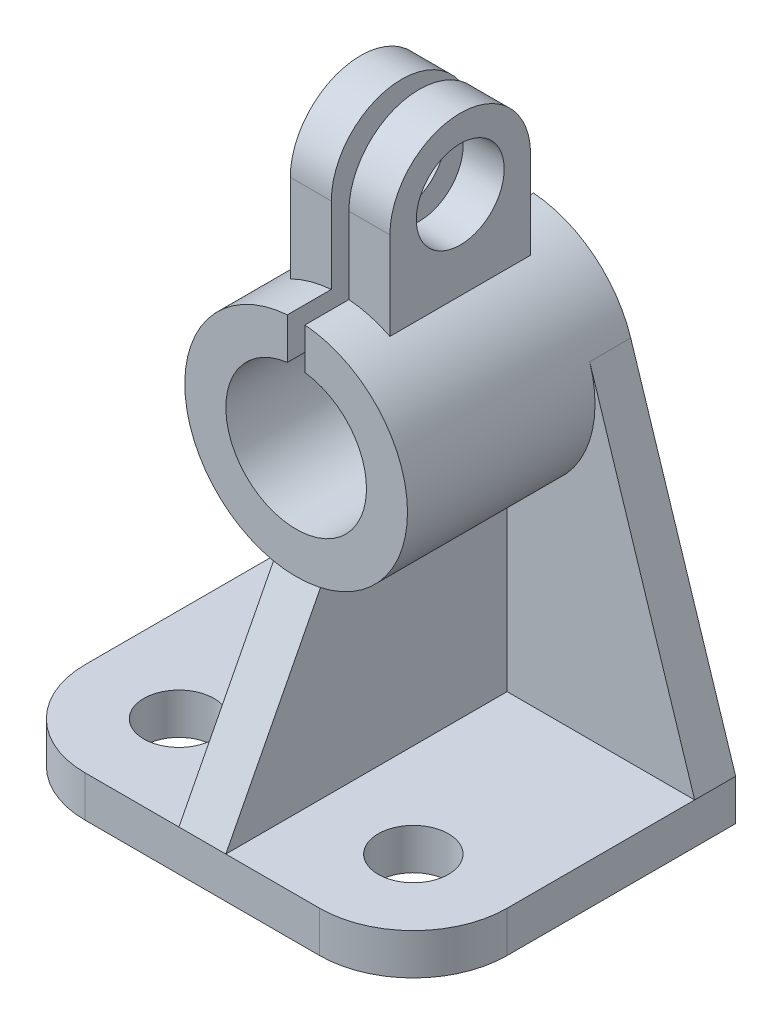
ISO-10303-21;
HEADER;
FILE_DESCRIPTION(('STEP AP214'),'2;1');
FILE_NAME('part.step','',(''),(''),'','','');
FILE_SCHEMA(('AUTOMOTIVE_DESIGN { 1 0 10303 214 1 1 1 1 }'));
ENDSEC;
DATA;
#1=APPLICATION_CONTEXT('core data for automotive mechanical design processes');
#2=APPLICATION_PROTOCOL_DEFINITION('international standard','automotive_design',2000,#1);
#3=PRODUCT_CONTEXT('',#1,'mechanical');
#4=PRODUCT('Part','Part','',(#3));
#5=PRODUCT_RELATED_PRODUCT_CATEGORY('part','',(#4));
#6=PRODUCT_DEFINITION_FORMATION('','',#4);
#7=PRODUCT_DEFINITION_CONTEXT('part definition',#1,'design');
#8=PRODUCT_DEFINITION('design','',#6,#7);
#9=PRODUCT_DEFINITION_SHAPE('','',#8);
#10=(LENGTH_UNIT() NAMED_UNIT(*) SI_UNIT(.MILLI.,.METRE.));
#11=(NAMED_UNIT(*) PLANE_ANGLE_UNIT() SI_UNIT($,.RADIAN.));
#12=(NAMED_UNIT(*) SI_UNIT($,.STERADIAN.) SOLID_ANGLE_UNIT());
#13=UNCERTAINTY_MEASURE_WITH_UNIT(LENGTH_MEASURE(1.E-05),#10,'distance_accuracy_value','');
#14=(GEOMETRIC_REPRESENTATION_CONTEXT(3) GLOBAL_UNCERTAINTY_ASSIGNED_CONTEXT((#13)) GLOBAL_UNIT_ASSIGNED_CONTEXT((#10,
#11,#12)) REPRESENTATION_CONTEXT('',''));
#15=CARTESIAN_POINT('',(0.,0.,0.));
#16=DIRECTION('',(0.,0.,1.));
#17=DIRECTION('',(1.,0.,0.));
#18=AXIS2_PLACEMENT_3D('',#15,#16,#17);
#19=CARTESIAN_POINT('',(0.,3.5,55.));
#20=DIRECTION('',(0.,1.,0.));
#21=DIRECTION('',(0.,0.,1.));
#22=AXIS2_PLACEMENT_3D('',#19,#20,#21);
#23=PLANE('',#22);
#24=CARTESIAN_POINT('',(-20.,3.5,39.));
#25=DIRECTION('',(0.,1.,0.));
#26=DIRECTION('',(0.,0.,1.));
#27=AXIS2_PLACEMENT_3D('',#24,#25,#26);
#28=CIRCLE('',#27,6.);
#29=CARTESIAN_POINT('',(-20.,3.5,45.));
#30=VERTEX_POINT('',#29);
#31=EDGE_CURVE('E432',#30,#30,#28,.T.);
#32=ORIENTED_EDGE('',*,*,#31,.F.);
#33=EDGE_LOOP('',(#32));
#34=FACE_BOUND('',#33,.T.);
#35=DIRECTION('',(0.,0.,-1.));
#36=VECTOR('',#35,1.);
#37=CARTESIAN_POINT('',(-36.,3.5,55.));
#38=LINE('',#37,#36);
#39=CARTESIAN_POINT('',(-36.,3.5,39.));
#40=VERTEX_POINT('',#39);
#41=CARTESIAN_POINT('',(-36.,3.5,7.));
#42=VERTEX_POINT('',#41);
#43=EDGE_CURVE('E358',#40,#42,#38,.T.);
#44=ORIENTED_EDGE('',*,*,#43,.F.);
#45=CARTESIAN_POINT('',(-20.,3.5,39.));
#46=DIRECTION('',(0.,1.,0.));
#47=DIRECTION('',(0.,0.,1.));
#48=AXIS2_PLACEMENT_3D('',#45,#46,#47);
#49=CIRCLE('',#48,16.);
#50=CARTESIAN_POINT('',(-20.,3.5,55.));
#51=VERTEX_POINT('',#50);
#52=EDGE_CURVE('E387',#40,#51,#49,.T.);
#53=ORIENTED_EDGE('',*,*,#52,.T.);
#54=DIRECTION('',(1.,0.,0.));
#55=VECTOR('',#54,1.);
#56=CARTESIAN_POINT('',(0.,3.5,55.));
#57=LINE('',#56,#55);
#58=CARTESIAN_POINT('',(-4.,3.5,55.));
#59=VERTEX_POINT('',#58);
#60=EDGE_CURVE('E348',#51,#59,#57,.T.);
#61=ORIENTED_EDGE('',*,*,#60,.T.);
#62=DIRECTION('',(0.,0.,-1.));
#63=VECTOR('',#62,1.);
#64=CARTESIAN_POINT('',(-4.,3.5,55.));
#65=LINE('',#64,#63);
#66=CARTESIAN_POINT('',(-4.,3.5,7.));
#67=VERTEX_POINT('',#66);
#68=EDGE_CURVE('E231',#59,#67,#65,.T.);
#69=ORIENTED_EDGE('',*,*,#68,.T.);
#70=DIRECTION('',(1.,0.,0.));
#71=VECTOR('',#70,1.);
#72=CARTESIAN_POINT('',(0.,3.5,7.));
#73=LINE('',#72,#71);
#74=EDGE_CURVE('E228',#42,#67,#73,.T.);
#75=ORIENTED_EDGE('',*,*,#74,.F.);
#76=EDGE_LOOP('',(#44,#53,#61,#69,#75));
#77=FACE_BOUND('',#76,.T.);
#78=ADVANCED_FACE('F43',(#34,#77),#23,.T.);
#79=CARTESIAN_POINT('',(0.,0.,7.));
#80=DIRECTION('',(0.,0.,1.));
#81=DIRECTION('',(1.,0.,0.));
#82=AXIS2_PLACEMENT_3D('',#79,#80,#81);
#83=PLANE('',#82);
#84=ORIENTED_EDGE('',*,*,#74,.T.);
#85=DIRECTION('',(0.,1.,0.));
#86=VECTOR('',#85,1.);
#87=CARTESIAN_POINT('',(-4.,0.,7.));
#88=LINE('',#87,#86);
#89=CARTESIAN_POINT('',(-4.,34.9258243789933,7.));
#90=VERTEX_POINT('',#89);
#91=EDGE_CURVE('E225',#67,#90,#88,.T.);
#92=ORIENTED_EDGE('',*,*,#91,.T.);
#93=CARTESIAN_POINT('',(0.,53.5,7.));
#94=DIRECTION('',(0.,0.,1.));
#95=DIRECTION('',(1.,0.,0.));
#96=AXIS2_PLACEMENT_3D('',#93,#94,#95);
#97=CIRCLE('',#96,19.);
#98=CARTESIAN_POINT('',(-18.0912616954563,59.3057084207285,7.));
#99=VERTEX_POINT('',#98);
#100=EDGE_CURVE('E210',#99,#90,#97,.T.);
#101=ORIENTED_EDGE('',*,*,#100,.F.);
#102=DIRECTION('',(-0.305563601090973,-0.952171668181907,0.));
#103=VECTOR('',#102,1.);
#104=CARTESIAN_POINT('',(-33.657033398032,10.8009560364036,7.));
#105=LINE('',#104,#103);
#106=EDGE_CURVE('E220',#99,#42,#105,.T.);
#107=ORIENTED_EDGE('',*,*,#106,.T.);
#108=EDGE_LOOP('',(#84,#92,#101,#107));
#109=FACE_BOUND('',#108,.T.);
#110=ADVANCED_FACE('F226',(#109),#83,.T.);
#111=CARTESIAN_POINT('',(0.,53.5,39.));
#112=DIRECTION('',(0.,0.,-1.));
#113=DIRECTION('',(-1.,0.,0.));
#114=AXIS2_PLACEMENT_3D('',#111,#112,#113);
#115=CYLINDRICAL_SURFACE('',#114,19.);
#116=CARTESIAN_POINT('',(0.,53.5,0.));
#117=DIRECTION('',(0.,0.,1.));
#118=DIRECTION('',(1.,0.,0.));
#119=AXIS2_PLACEMENT_3D('',#116,#117,#118);
#120=CIRCLE('',#119,19.);
#121=CARTESIAN_POINT('',(18.0912616954563,59.3057084207285,0.));
#122=VERTEX_POINT('',#121);
#123=CARTESIAN_POINT('',(1.5,72.4406969248758,0.));
#124=VERTEX_POINT('',#123);
#125=EDGE_CURVE('E287',#122,#124,#120,.T.);
#126=ORIENTED_EDGE('',*,*,#125,.T.);
#127=DIRECTION('',(0.,0.,-1.));
#128=VECTOR('',#127,1.);
#129=CARTESIAN_POINT('',(1.5,72.4406969248758,39.));
#130=LINE('',#129,#128);
#131=CARTESIAN_POINT('',(1.5,72.4406969248758,7.5));
#132=VERTEX_POINT('',#131);
#133=EDGE_CURVE('E318',#132,#124,#130,.T.);
#134=ORIENTED_EDGE('',*,*,#133,.F.);
#135=CARTESIAN_POINT('',(0.,53.5,7.5));
#136=DIRECTION('',(0.,0.,1.));
#137=DIRECTION('',(1.,0.,0.));
#138=AXIS2_PLACEMENT_3D('',#135,#136,#137);
#139=CIRCLE('',#138,19.);
#140=CARTESIAN_POINT('',(8.5,70.4926454679664,7.5));
#141=VERTEX_POINT('',#140);
#142=EDGE_CURVE('E269',#141,#132,#139,.T.);
#143=ORIENTED_EDGE('',*,*,#142,.F.);
#144=DIRECTION('',(0.,0.,-1.));
#145=VECTOR('',#144,1.);
#146=CARTESIAN_POINT('',(8.5,70.4926454679664,31.5));
#147=LINE('',#146,#145);
#148=CARTESIAN_POINT('',(8.5,70.4926454679664,31.5));
#149=VERTEX_POINT('',#148);
#150=EDGE_CURVE('E279',#149,#141,#147,.T.);
#151=ORIENTED_EDGE('',*,*,#150,.F.);
#152=CARTESIAN_POINT('',(0.,53.5,31.5));
#153=DIRECTION('',(0.,0.,1.));
#154=DIRECTION('',(1.,0.,0.));
#155=AXIS2_PLACEMENT_3D('',#152,#153,#154);
#156=CIRCLE('',#155,19.);
#157=CARTESIAN_POINT('',(1.5,72.4406969248758,31.5));
#158=VERTEX_POINT('',#157);
#159=EDGE_CURVE('E270',#149,#158,#156,.T.);
#160=ORIENTED_EDGE('',*,*,#159,.T.);
#161=CARTESIAN_POINT('',(1.5,72.4406969248758,39.));
#162=VERTEX_POINT('',#161);
#163=EDGE_CURVE('E319',#162,#158,#130,.T.);
#164=ORIENTED_EDGE('',*,*,#163,.F.);
#165=CARTESIAN_POINT('',(0.,53.5,39.));
#166=DIRECTION('',(0.,0.,1.));
#167=DIRECTION('',(1.,0.,0.));
#168=AXIS2_PLACEMENT_3D('',#165,#166,#167);
#169=CIRCLE('',#168,19.);
#170=CARTESIAN_POINT('',(0.,34.5,39.));
#171=VERTEX_POINT('',#170);
#172=EDGE_CURVE('E292',#171,#162,#169,.T.);
#173=ORIENTED_EDGE('',*,*,#172,.F.);
#174=CARTESIAN_POINT('',(0.,53.5,29.1935483870968));
#175=DIRECTION('',(0.,0.458642919770252,0.888620657054864));
#176=DIRECTION('',(0.,0.888620657054864,-0.458642919770252));
#177=AXIS2_PLACEMENT_3D('',#174,#175,#176);
#178=ELLIPSE('',#177,21.38145208437,19.);
#179=CARTESIAN_POINT('',(4.,34.9258243789933,38.7802196753583));
#180=VERTEX_POINT('',#179);
#181=EDGE_CURVE('E442',#171,#180,#178,.T.);
#182=ORIENTED_EDGE('',*,*,#181,.T.);
#183=DIRECTION('',(0.,0.,-1.));
#184=VECTOR('',#183,1.);
#185=CARTESIAN_POINT('',(4.,34.9258243789933,39.));
#186=LINE('',#185,#184);
#187=CARTESIAN_POINT('',(4.,34.9258243789933,7.));
#188=VERTEX_POINT('',#187);
#189=EDGE_CURVE('E440',#180,#188,#186,.T.);
#190=ORIENTED_EDGE('',*,*,#189,.T.);
#191=CARTESIAN_POINT('',(18.0912616954562,59.3057084207285,7.));
#192=VERTEX_POINT('',#191);
#193=EDGE_CURVE('E221',#188,#192,#97,.T.);
#194=ORIENTED_EDGE('',*,*,#193,.T.);
#195=DIRECTION('',(0.,0.,-1.));
#196=VECTOR('',#195,1.);
#197=CARTESIAN_POINT('',(18.0912616954563,59.3057084207285,7.));
#198=LINE('',#197,#196);
#199=EDGE_CURVE('E329',#192,#122,#198,.T.);
#200=ORIENTED_EDGE('',*,*,#199,.T.);
#201=EDGE_LOOP('',(#126,#134,#143,#151,#160,#164,#173,#182,#190,#194,#200));
#202=FACE_BOUND('',#201,.T.);
#203=ADVANCED_FACE('F448',(#202),#115,.T.);
#204=CARTESIAN_POINT('',(-1.5,85.5,19.5));
#205=DIRECTION('',(-1.,0.,0.));
#206=DIRECTION('',(0.,0.,1.));
#207=AXIS2_PLACEMENT_3D('',#204,#205,#206);
#208=CYLINDRICAL_SURFACE('',#207,12.);
#209=DIRECTION('',(1.,0.,0.));
#210=VECTOR('',#209,1.);
#211=CARTESIAN_POINT('',(-1.5,85.5,31.5));
#212=LINE('',#211,#210);
#213=CARTESIAN_POINT('',(-1.5,85.5,31.5));
#214=VERTEX_POINT('',#213);
#215=CARTESIAN_POINT('',(-8.5,85.5,31.5));
#216=VERTEX_POINT('',#215);
#217=EDGE_CURVE('E373',#214,#216,#212,.F.);
#218=ORIENTED_EDGE('',*,*,#217,.F.);
#219=CARTESIAN_POINT('',(-1.5,85.5,19.5));
#220=DIRECTION('',(-1.,0.,0.));
#221=DIRECTION('',(0.,-1.,0.));
#222=AXIS2_PLACEMENT_3D('',#219,#220,#221);
#223=CIRCLE('',#222,12.);
#224=CARTESIAN_POINT('',(-1.5,85.5,7.5));
#225=VERTEX_POINT('',#224);
#226=EDGE_CURVE('E378',#225,#214,#223,.F.);
#227=ORIENTED_EDGE('',*,*,#226,.F.);
#228=DIRECTION('',(-1.,0.,0.));
#229=VECTOR('',#228,1.);
#230=CARTESIAN_POINT('',(0.,85.5,7.5));
#231=LINE('',#230,#229);
#232=CARTESIAN_POINT('',(-8.5,85.5,7.5));
#233=VERTEX_POINT('',#232);
#234=EDGE_CURVE('E376',#233,#225,#231,.F.);
#235=ORIENTED_EDGE('',*,*,#234,.F.);
#236=CARTESIAN_POINT('',(-8.5,85.5,19.5));
#237=DIRECTION('',(1.,0.,0.));
#238=DIRECTION('',(0.,1.,0.));
#239=AXIS2_PLACEMENT_3D('',#236,#237,#238);
#240=CIRCLE('',#239,12.);
#241=EDGE_CURVE('E380',#216,#233,#240,.F.);
#242=ORIENTED_EDGE('',*,*,#241,.F.);
#243=EDGE_LOOP('',(#218,#227,#235,#242));
#244=FACE_BOUND('',#243,.T.);
#245=ADVANCED_FACE('F565',(#244),#208,.T.);
#246=CARTESIAN_POINT('',(8.5,85.5,19.5));
#247=DIRECTION('',(1.,0.,0.));
#248=DIRECTION('',(0.,0.,-1.));
#249=AXIS2_PLACEMENT_3D('',#246,#247,#248);
#250=CYLINDRICAL_SURFACE('',#249,12.);
#251=DIRECTION('',(-1.,0.,0.));
#252=VECTOR('',#251,1.);
#253=CARTESIAN_POINT('',(8.5,85.5,7.5));
#254=LINE('',#253,#252);
#255=CARTESIAN_POINT('',(1.5,85.5,7.5));
#256=VERTEX_POINT('',#255);
#257=CARTESIAN_POINT('',(8.5,85.5,7.5));
#258=VERTEX_POINT('',#257);
#259=EDGE_CURVE('E367',#256,#258,#254,.F.);
#260=ORIENTED_EDGE('',*,*,#259,.F.);
#261=CARTESIAN_POINT('',(1.5,85.5,19.5));
#262=DIRECTION('',(-1.,0.,0.));
#263=DIRECTION('',(0.,-1.,0.));
#264=AXIS2_PLACEMENT_3D('',#261,#262,#263);
#265=CIRCLE('',#264,12.);
#266=CARTESIAN_POINT('',(1.5,85.5,31.5));
#267=VERTEX_POINT('',#266);
#268=EDGE_CURVE('E371',#267,#256,#265,.T.);
#269=ORIENTED_EDGE('',*,*,#268,.F.);
#270=DIRECTION('',(1.,0.,0.));
#271=VECTOR('',#270,1.);
#272=CARTESIAN_POINT('',(0.,85.5,31.5));
#273=LINE('',#272,#271);
#274=CARTESIAN_POINT('',(8.5,85.5,31.5));
#275=VERTEX_POINT('',#274);
#276=EDGE_CURVE('E364',#275,#267,#273,.F.);
#277=ORIENTED_EDGE('',*,*,#276,.F.);
#278=CARTESIAN_POINT('',(8.5,85.5,19.5));
#279=DIRECTION('',(1.,0.,0.));
#280=DIRECTION('',(0.,1.,0.));
#281=AXIS2_PLACEMENT_3D('',#278,#279,#280);
#282=CIRCLE('',#281,12.);
#283=EDGE_CURVE('E369',#258,#275,#282,.T.);
#284=ORIENTED_EDGE('',*,*,#283,.F.);
#285=EDGE_LOOP('',(#260,#269,#277,#284));
#286=FACE_BOUND('',#285,.T.);
#287=ADVANCED_FACE('F571',(#286),#250,.T.);
#288=CARTESIAN_POINT('',(0.,-3.5,55.));
#289=DIRECTION('',(0.,1.,0.));
#290=DIRECTION('',(0.,0.,1.));
#291=AXIS2_PLACEMENT_3D('',#288,#289,#290);
#292=PLANE('',#291);
#293=CARTESIAN_POINT('',(20.,-3.5,39.));
#294=DIRECTION('',(0.,1.,0.));
#295=DIRECTION('',(0.,0.,1.));
#296=AXIS2_PLACEMENT_3D('',#293,#294,#295);
#297=CIRCLE('',#296,6.);
#298=CARTESIAN_POINT('',(20.,-3.5,45.));
#299=VERTEX_POINT('',#298);
#300=EDGE_CURVE('E585',#299,#299,#297,.T.);
#301=ORIENTED_EDGE('',*,*,#300,.T.);
#302=EDGE_LOOP('',(#301));
#303=FACE_BOUND('',#302,.T.);
#304=CARTESIAN_POINT('',(-20.,-3.5,39.));
#305=DIRECTION('',(0.,1.,0.));
#306=DIRECTION('',(0.,0.,1.));
#307=AXIS2_PLACEMENT_3D('',#304,#305,#306);
#308=CIRCLE('',#307,6.);
#309=CARTESIAN_POINT('',(-20.,-3.5,45.));
#310=VERTEX_POINT('',#309);
#311=EDGE_CURVE('E427',#310,#310,#308,.T.);
#312=ORIENTED_EDGE('',*,*,#311,.T.);
#313=EDGE_LOOP('',(#312));
#314=FACE_BOUND('',#313,.T.);
#315=DIRECTION('',(1.,0.,0.));
#316=VECTOR('',#315,1.);
#317=CARTESIAN_POINT('',(0.,-3.5,55.));
#318=LINE('',#317,#316);
#319=CARTESIAN_POINT('',(-20.,-3.5,55.));
#320=VERTEX_POINT('',#319);
#321=CARTESIAN_POINT('',(20.,-3.5,55.));
#322=VERTEX_POINT('',#321);
#323=EDGE_CURVE('E343',#320,#322,#318,.T.);
#324=ORIENTED_EDGE('',*,*,#323,.F.);
#325=CARTESIAN_POINT('',(-20.,-3.5,39.));
#326=DIRECTION('',(0.,1.,0.));
#327=DIRECTION('',(0.,0.,1.));
#328=AXIS2_PLACEMENT_3D('',#325,#326,#327);
#329=CIRCLE('',#328,16.);
#330=CARTESIAN_POINT('',(-36.,-3.5,39.));
#331=VERTEX_POINT('',#330);
#332=EDGE_CURVE('E396',#320,#331,#329,.F.);
#333=ORIENTED_EDGE('',*,*,#332,.T.);
#334=DIRECTION('',(0.,0.,-1.));
#335=VECTOR('',#334,1.);
#336=CARTESIAN_POINT('',(-36.,-3.5,55.));
#337=LINE('',#336,#335);
#338=CARTESIAN_POINT('',(-36.,-3.5,0.));
#339=VERTEX_POINT('',#338);
#340=EDGE_CURVE('E350',#331,#339,#337,.T.);
#341=ORIENTED_EDGE('',*,*,#340,.T.);
#342=DIRECTION('',(1.,0.,0.));
#343=VECTOR('',#342,1.);
#344=CARTESIAN_POINT('',(0.,-3.5,0.));
#345=LINE('',#344,#343);
#346=CARTESIAN_POINT('',(36.,-3.5,0.));
#347=VERTEX_POINT('',#346);
#348=EDGE_CURVE('E342',#339,#347,#345,.T.);
#349=ORIENTED_EDGE('',*,*,#348,.T.);
#350=DIRECTION('',(0.,0.,-1.));
#351=VECTOR('',#350,1.);
#352=CARTESIAN_POINT('',(36.,-3.5,55.));
#353=LINE('',#352,#351);
#354=CARTESIAN_POINT('',(36.,-3.5,39.));
#355=VERTEX_POINT('',#354);
#356=EDGE_CURVE('E362',#355,#347,#353,.T.);
#357=ORIENTED_EDGE('',*,*,#356,.F.);
#358=CARTESIAN_POINT('',(20.,-3.5,39.));
#359=DIRECTION('',(0.,1.,0.));
#360=DIRECTION('',(0.,0.,1.));
#361=AXIS2_PLACEMENT_3D('',#358,#359,#360);
#362=CIRCLE('',#361,16.);
#363=EDGE_CURVE('E394',#355,#322,#362,.F.);
#364=ORIENTED_EDGE('',*,*,#363,.T.);
#365=EDGE_LOOP('',(#324,#333,#341,#349,#357,#364));
#366=FACE_BOUND('',#365,.T.);
#367=ADVANCED_FACE('F401',(#303,#314,#366),#292,.F.);
#368=CARTESIAN_POINT('',(36.,0.,55.));
#369=DIRECTION('',(-1.,0.,0.));
#370=DIRECTION('',(0.,0.,1.));
#371=AXIS2_PLACEMENT_3D('',#368,#369,#370);
#372=PLANE('',#371);
#373=DIRECTION('',(0.,0.,-1.));
#374=VECTOR('',#373,1.);
#375=CARTESIAN_POINT('',(36.,3.5,55.));
#376=LINE('',#375,#374);
#377=CARTESIAN_POINT('',(36.,3.5,39.));
#378=VERTEX_POINT('',#377);
#379=CARTESIAN_POINT('',(36.,3.5,7.));
#380=VERTEX_POINT('',#379);
#381=EDGE_CURVE('E360',#378,#380,#376,.T.);
#382=ORIENTED_EDGE('',*,*,#381,.F.);
#383=DIRECTION('',(0.,1.,0.));
#384=VECTOR('',#383,1.);
#385=CARTESIAN_POINT('',(36.,-3.5,39.));
#386=LINE('',#385,#384);
#387=EDGE_CURVE('E11',#378,#355,#386,.F.);
#388=ORIENTED_EDGE('',*,*,#387,.T.);
#389=ORIENTED_EDGE('',*,*,#356,.T.);
#390=DIRECTION('',(0.,1.,0.));
#391=VECTOR('',#390,1.);
#392=CARTESIAN_POINT('',(36.,0.,0.));
#393=LINE('',#392,#391);
#394=CARTESIAN_POINT('',(36.,3.5,0.));
#395=VERTEX_POINT('',#394);
#396=EDGE_CURVE('E353',#347,#395,#393,.T.);
#397=ORIENTED_EDGE('',*,*,#396,.T.);
#398=DIRECTION('',(0.,0.,-1.));
#399=VECTOR('',#398,1.);
#400=CARTESIAN_POINT('',(36.,3.5,7.));
#401=LINE('',#400,#399);
#402=EDGE_CURVE('E336',#380,#395,#401,.T.);
#403=ORIENTED_EDGE('',*,*,#402,.F.);
#404=EDGE_LOOP('',(#382,#388,#389,#397,#403));
#405=FACE_BOUND('',#404,.T.);
#406=ADVANCED_FACE('F538',(#405),#372,.F.);
#407=CARTESIAN_POINT('',(20.,3.5,39.));
#408=DIRECTION('',(0.,1.,0.));
#409=DIRECTION('',(0.,0.,1.));
#410=AXIS2_PLACEMENT_3D('',#407,#408,#409);
#411=CIRCLE('',#410,6.);
#412=CARTESIAN_POINT('',(20.,3.5,45.));
#413=VERTEX_POINT('',#412);
#414=EDGE_CURVE('E546',#413,#413,#411,.T.);
#415=ORIENTED_EDGE('',*,*,#414,.F.);
#416=EDGE_LOOP('',(#415));
#417=FACE_BOUND('',#416,.T.);
#418=CARTESIAN_POINT('',(4.,3.5,55.));
#419=VERTEX_POINT('',#418);
#420=CARTESIAN_POINT('',(20.,3.5,55.));
#421=VERTEX_POINT('',#420);
#422=EDGE_CURVE('E346',#419,#421,#57,.T.);
#423=ORIENTED_EDGE('',*,*,#422,.T.);
#424=CARTESIAN_POINT('',(20.,3.5,39.));
#425=DIRECTION('',(0.,1.,0.));
#426=DIRECTION('',(0.,0.,1.));
#427=AXIS2_PLACEMENT_3D('',#424,#425,#426);
#428=CIRCLE('',#427,16.);
#429=EDGE_CURVE('E51',#421,#378,#428,.T.);
#430=ORIENTED_EDGE('',*,*,#429,.T.);
#431=ORIENTED_EDGE('',*,*,#381,.T.);
#432=CARTESIAN_POINT('',(4.,3.5,7.));
#433=VERTEX_POINT('',#432);
#434=EDGE_CURVE('E324',#433,#380,#73,.T.);
#435=ORIENTED_EDGE('',*,*,#434,.F.);
#436=DIRECTION('',(0.,0.,-1.));
#437=VECTOR('',#436,1.);
#438=CARTESIAN_POINT('',(4.,3.5,55.));
#439=LINE('',#438,#437);
#440=EDGE_CURVE('E429',#419,#433,#439,.T.);
#441=ORIENTED_EDGE('',*,*,#440,.F.);
#442=EDGE_LOOP('',(#423,#430,#431,#435,#441));
#443=FACE_BOUND('',#442,.T.);
#444=ADVANCED_FACE('F529',(#417,#443),#23,.T.);
#445=CARTESIAN_POINT('',(-36.,0.,55.));
#446=DIRECTION('',(-1.,0.,0.));
#447=DIRECTION('',(0.,0.,1.));
#448=AXIS2_PLACEMENT_3D('',#445,#446,#447);
#449=PLANE('',#448);
#450=ORIENTED_EDGE('',*,*,#340,.F.);
#451=DIRECTION('',(0.,1.,0.));
#452=VECTOR('',#451,1.);
#453=CARTESIAN_POINT('',(-36.,0.,39.));
#454=LINE('',#453,#452);
#455=EDGE_CURVE('E382',#331,#40,#454,.T.);
#456=ORIENTED_EDGE('',*,*,#455,.T.);
#457=ORIENTED_EDGE('',*,*,#43,.T.);
#458=DIRECTION('',(0.,0.,-1.));
#459=VECTOR('',#458,1.);
#460=CARTESIAN_POINT('',(-36.,3.5,7.));
#461=LINE('',#460,#459);
#462=CARTESIAN_POINT('',(-36.,3.5,0.));
#463=VERTEX_POINT('',#462);
#464=EDGE_CURVE('E339',#42,#463,#461,.T.);
#465=ORIENTED_EDGE('',*,*,#464,.T.);
#466=DIRECTION('',(0.,1.,0.));
#467=VECTOR('',#466,1.);
#468=CARTESIAN_POINT('',(-36.,0.,0.));
#469=LINE('',#468,#467);
#470=EDGE_CURVE('E347',#339,#463,#469,.T.);
#471=ORIENTED_EDGE('',*,*,#470,.F.);
#472=EDGE_LOOP('',(#450,#456,#457,#465,#471));
#473=FACE_BOUND('',#472,.T.);
#474=ADVANCED_FACE('F408',(#473),#449,.T.);
#475=CARTESIAN_POINT('',(0.,0.,55.));
#476=DIRECTION('',(0.,0.,1.));
#477=DIRECTION('',(1.,0.,0.));
#478=AXIS2_PLACEMENT_3D('',#475,#476,#477);
#479=PLANE('',#478);
#480=ORIENTED_EDGE('',*,*,#60,.F.);
#481=DIRECTION('',(0.,1.,0.));
#482=VECTOR('',#481,1.);
#483=CARTESIAN_POINT('',(-20.,0.,55.));
#484=LINE('',#483,#482);
#485=EDGE_CURVE('E392',#51,#320,#484,.F.);
#486=ORIENTED_EDGE('',*,*,#485,.T.);
#487=ORIENTED_EDGE('',*,*,#323,.T.);
#488=DIRECTION('',(0.,1.,0.));
#489=VECTOR('',#488,1.);
#490=CARTESIAN_POINT('',(20.,3.5,55.));
#491=LINE('',#490,#489);
#492=EDGE_CURVE('E389',#322,#421,#491,.T.);
#493=ORIENTED_EDGE('',*,*,#492,.T.);
#494=ORIENTED_EDGE('',*,*,#422,.F.);
#495=DIRECTION('',(-1.,0.,0.));
#496=VECTOR('',#495,1.);
#497=CARTESIAN_POINT('',(0.,3.5,55.));
#498=LINE('',#497,#496);
#499=EDGE_CURVE('E418',#419,#59,#498,.T.);
#500=ORIENTED_EDGE('',*,*,#499,.T.);
#501=EDGE_LOOP('',(#480,#486,#487,#493,#494,#500));
#502=FACE_BOUND('',#501,.T.);
#503=ADVANCED_FACE('F415',(#502),#479,.T.);
#504=CARTESIAN_POINT('',(0.,0.,0.));
#505=DIRECTION('',(0.,0.,1.));
#506=DIRECTION('',(1.,0.,0.));
#507=AXIS2_PLACEMENT_3D('',#504,#505,#506);
#508=PLANE('',#507);
#509=CARTESIAN_POINT('',(0.,53.5,0.));
#510=DIRECTION('',(0.,0.,1.));
#511=DIRECTION('',(1.,0.,0.));
#512=AXIS2_PLACEMENT_3D('',#509,#510,#511);
#513=CIRCLE('',#512,12.);
#514=CARTESIAN_POINT('',(-1.5,65.4058808997907,0.));
#515=VERTEX_POINT('',#514);
#516=CARTESIAN_POINT('',(1.5,65.4058808997907,0.));
#517=VERTEX_POINT('',#516);
#518=EDGE_CURVE('E306',#515,#517,#513,.T.);
#519=ORIENTED_EDGE('',*,*,#518,.T.);
#520=DIRECTION('',(0.,1.,0.));
#521=VECTOR('',#520,1.);
#522=CARTESIAN_POINT('',(1.5,0.,0.));
#523=LINE('',#522,#521);
#524=EDGE_CURVE('E303',#517,#124,#523,.T.);
#525=ORIENTED_EDGE('',*,*,#524,.T.);
#526=ORIENTED_EDGE('',*,*,#125,.F.);
#527=DIRECTION('',(-0.305563601090973,0.952171668181908,0.));
#528=VECTOR('',#527,1.);
#529=CARTESIAN_POINT('',(33.657033398032,10.8009560364036,0.));
#530=LINE('',#529,#528);
#531=EDGE_CURVE('E332',#395,#122,#530,.T.);
#532=ORIENTED_EDGE('',*,*,#531,.F.);
#533=ORIENTED_EDGE('',*,*,#396,.F.);
#534=ORIENTED_EDGE('',*,*,#348,.F.);
#535=ORIENTED_EDGE('',*,*,#470,.T.);
#536=DIRECTION('',(-0.305563601090973,-0.952171668181907,0.));
#537=VECTOR('',#536,1.);
#538=CARTESIAN_POINT('',(-33.657033398032,10.8009560364036,0.));
#539=LINE('',#538,#537);
#540=CARTESIAN_POINT('',(-18.0912616954563,59.3057084207285,0.));
#541=VERTEX_POINT('',#540);
#542=EDGE_CURVE('E321',#541,#463,#539,.T.);
#543=ORIENTED_EDGE('',*,*,#542,.F.);
#544=CARTESIAN_POINT('',(-1.5,72.4406969248758,0.));
#545=VERTEX_POINT('',#544);
#546=EDGE_CURVE('E301',#545,#541,#120,.T.);
#547=ORIENTED_EDGE('',*,*,#546,.F.);
#548=DIRECTION('',(0.,1.,0.));
#549=VECTOR('',#548,1.);
#550=CARTESIAN_POINT('',(-1.5,0.,0.));
#551=LINE('',#550,#549);
#552=EDGE_CURVE('E309',#515,#545,#551,.T.);
#553=ORIENTED_EDGE('',*,*,#552,.F.);
#554=EDGE_LOOP('',(#519,#525,#526,#532,#533,#534,#535,#543,#547,#553));
#555=FACE_BOUND('',#554,.T.);
#556=ADVANCED_FACE('F472',(#555),#508,.F.);
#557=CARTESIAN_POINT('',(-33.657033398032,10.8009560364036,7.));
#558=DIRECTION('',(0.952171668181907,-0.305563601090973,0.));
#559=DIRECTION('',(0.305563601090973,0.952171668181908,0.));
#560=AXIS2_PLACEMENT_3D('',#557,#558,#559);
#561=PLANE('',#560);
#562=ORIENTED_EDGE('',*,*,#542,.T.);
#563=ORIENTED_EDGE('',*,*,#464,.F.);
#564=ORIENTED_EDGE('',*,*,#106,.F.);
#565=DIRECTION('',(0.,0.,-1.));
#566=VECTOR('',#565,1.);
#567=CARTESIAN_POINT('',(-18.0912616954563,59.3057084207285,7.));
#568=LINE('',#567,#566);
#569=EDGE_CURVE('E217',#99,#541,#568,.T.);
#570=ORIENTED_EDGE('',*,*,#569,.T.);
#571=EDGE_LOOP('',(#562,#563,#564,#570));
#572=FACE_BOUND('',#571,.T.);
#573=ADVANCED_FACE('F516',(#572),#561,.F.);
#574=CARTESIAN_POINT('',(33.657033398032,10.8009560364036,7.));
#575=DIRECTION('',(-0.952171668181908,-0.305563601090973,0.));
#576=DIRECTION('',(0.305563601090973,-0.952171668181908,0.));
#577=AXIS2_PLACEMENT_3D('',#574,#575,#576);
#578=PLANE('',#577);
#579=ORIENTED_EDGE('',*,*,#531,.T.);
#580=ORIENTED_EDGE('',*,*,#199,.F.);
#581=DIRECTION('',(-0.305563601090973,0.952171668181908,0.));
#582=VECTOR('',#581,1.);
#583=CARTESIAN_POINT('',(33.657033398032,10.8009560364036,7.));
#584=LINE('',#583,#582);
#585=EDGE_CURVE('E326',#380,#192,#584,.T.);
#586=ORIENTED_EDGE('',*,*,#585,.F.);
#587=ORIENTED_EDGE('',*,*,#402,.T.);
#588=EDGE_LOOP('',(#579,#580,#586,#587));
#589=FACE_BOUND('',#588,.T.);
#590=ADVANCED_FACE('F466',(#589),#578,.F.);
#591=DIRECTION('',(0.,1.,0.));
#592=VECTOR('',#591,1.);
#593=CARTESIAN_POINT('',(4.,0.,7.));
#594=LINE('',#593,#592);
#595=EDGE_CURVE('E437',#433,#188,#594,.T.);
#596=ORIENTED_EDGE('',*,*,#595,.F.);
#597=ORIENTED_EDGE('',*,*,#434,.T.);
#598=ORIENTED_EDGE('',*,*,#585,.T.);
#599=ORIENTED_EDGE('',*,*,#193,.F.);
#600=EDGE_LOOP('',(#596,#597,#598,#599));
#601=FACE_BOUND('',#600,.T.);
#602=ADVANCED_FACE('F460',(#601),#83,.T.);
#603=ORIENTED_EDGE('',*,*,#546,.T.);
#604=ORIENTED_EDGE('',*,*,#569,.F.);
#605=ORIENTED_EDGE('',*,*,#100,.T.);
#606=DIRECTION('',(0.,0.,-1.));
#607=VECTOR('',#606,1.);
#608=CARTESIAN_POINT('',(-4.,34.9258243789933,39.));
#609=LINE('',#608,#607);
#610=CARTESIAN_POINT('',(-4.,34.9258243789933,38.7802196753583));
#611=VERTEX_POINT('',#610);
#612=EDGE_CURVE('E214',#611,#90,#609,.T.);
#613=ORIENTED_EDGE('',*,*,#612,.F.);
#614=EDGE_CURVE('E422',#611,#171,#178,.T.);
#615=ORIENTED_EDGE('',*,*,#614,.T.);
#616=CARTESIAN_POINT('',(-1.5,72.4406969248758,39.));
#617=VERTEX_POINT('',#616);
#618=EDGE_CURVE('E288',#617,#171,#169,.T.);
#619=ORIENTED_EDGE('',*,*,#618,.F.);
#620=DIRECTION('',(0.,0.,-1.));
#621=VECTOR('',#620,1.);
#622=CARTESIAN_POINT('',(-1.5,72.4406969248758,39.));
#623=LINE('',#622,#621);
#624=CARTESIAN_POINT('',(-1.5,72.4406969248758,31.5));
#625=VERTEX_POINT('',#624);
#626=EDGE_CURVE('E312',#617,#625,#623,.T.);
#627=ORIENTED_EDGE('',*,*,#626,.T.);
#628=CARTESIAN_POINT('',(0.,53.5,31.5));
#629=DIRECTION('',(0.,0.,1.));
#630=DIRECTION('',(1.,0.,0.));
#631=AXIS2_PLACEMENT_3D('',#628,#629,#630);
#632=CIRCLE('',#631,19.);
#633=CARTESIAN_POINT('',(-8.5,70.4926454679664,31.5));
#634=VERTEX_POINT('',#633);
#635=EDGE_CURVE('E251',#625,#634,#632,.T.);
#636=ORIENTED_EDGE('',*,*,#635,.T.);
#637=DIRECTION('',(0.,0.,-1.));
#638=VECTOR('',#637,1.);
#639=CARTESIAN_POINT('',(-8.5,70.4926454679664,31.5));
#640=LINE('',#639,#638);
#641=CARTESIAN_POINT('',(-8.5,70.4926454679664,7.5));
#642=VERTEX_POINT('',#641);
#643=EDGE_CURVE('E260',#634,#642,#640,.T.);
#644=ORIENTED_EDGE('',*,*,#643,.T.);
#645=CARTESIAN_POINT('',(0.,53.5,7.5));
#646=DIRECTION('',(0.,0.,1.));
#647=DIRECTION('',(1.,0.,0.));
#648=AXIS2_PLACEMENT_3D('',#645,#646,#647);
#649=CIRCLE('',#648,19.);
#650=CARTESIAN_POINT('',(-1.5,72.4406969248758,7.5));
#651=VERTEX_POINT('',#650);
#652=EDGE_CURVE('E250',#651,#642,#649,.T.);
#653=ORIENTED_EDGE('',*,*,#652,.F.);
#654=EDGE_CURVE('E300',#651,#545,#623,.T.);
#655=ORIENTED_EDGE('',*,*,#654,.T.);
#656=EDGE_LOOP('',(#603,#604,#605,#613,#615,#619,#627,#636,#644,#653,#655));
#657=FACE_BOUND('',#656,.T.);
#658=ADVANCED_FACE('F212',(#657),#115,.T.);
#659=CARTESIAN_POINT('',(1.5,0.,39.));
#660=DIRECTION('',(-1.,0.,0.));
#661=DIRECTION('',(0.,-1.,0.));
#662=AXIS2_PLACEMENT_3D('',#659,#660,#661);
#663=PLANE('',#662);
#664=CARTESIAN_POINT('',(1.5,85.5,19.5));
#665=DIRECTION('',(-1.,0.,0.));
#666=DIRECTION('',(0.,-1.,0.));
#667=AXIS2_PLACEMENT_3D('',#664,#665,#666);
#668=CIRCLE('',#667,7.49999999999999);
#669=CARTESIAN_POINT('',(1.5,78.,19.5));
#670=VERTEX_POINT('',#669);
#671=EDGE_CURVE('E244',#670,#670,#668,.T.);
#672=ORIENTED_EDGE('',*,*,#671,.F.);
#673=EDGE_LOOP('',(#672));
#674=FACE_BOUND('',#673,.T.);
#675=ORIENTED_EDGE('',*,*,#524,.F.);
#676=DIRECTION('',(0.,0.,-1.));
#677=VECTOR('',#676,1.);
#678=CARTESIAN_POINT('',(1.5,65.4058808997907,39.));
#679=LINE('',#678,#677);
#680=CARTESIAN_POINT('',(1.5,65.4058808997907,39.));
#681=VERTEX_POINT('',#680);
#682=EDGE_CURVE('E316',#681,#517,#679,.T.);
#683=ORIENTED_EDGE('',*,*,#682,.F.);
#684=DIRECTION('',(0.,1.,0.));
#685=VECTOR('',#684,1.);
#686=CARTESIAN_POINT('',(1.5,0.,39.));
#687=LINE('',#686,#685);
#688=EDGE_CURVE('E291',#681,#162,#687,.T.);
#689=ORIENTED_EDGE('',*,*,#688,.T.);
#690=ORIENTED_EDGE('',*,*,#163,.T.);
#691=DIRECTION('',(0.,1.,0.));
#692=VECTOR('',#691,1.);
#693=CARTESIAN_POINT('',(1.5,0.,31.5));
#694=LINE('',#693,#692);
#695=EDGE_CURVE('E276',#158,#267,#694,.T.);
#696=ORIENTED_EDGE('',*,*,#695,.T.);
#697=ORIENTED_EDGE('',*,*,#268,.T.);
#698=DIRECTION('',(0.,1.,0.));
#699=VECTOR('',#698,1.);
#700=CARTESIAN_POINT('',(1.5,0.,7.5));
#701=LINE('',#700,#699);
#702=EDGE_CURVE('E274',#132,#256,#701,.T.);
#703=ORIENTED_EDGE('',*,*,#702,.F.);
#704=ORIENTED_EDGE('',*,*,#133,.T.);
#705=EDGE_LOOP('',(#675,#683,#689,#690,#696,#697,#703,#704));
#706=FACE_BOUND('',#705,.T.);
#707=ADVANCED_FACE('F478',(#674,#706),#663,.T.);
#708=CARTESIAN_POINT('',(0.,53.5,39.));
#709=DIRECTION('',(0.,0.,-1.));
#710=DIRECTION('',(-1.,0.,0.));
#711=AXIS2_PLACEMENT_3D('',#708,#709,#710);
#712=CYLINDRICAL_SURFACE('',#711,12.);
#713=ORIENTED_EDGE('',*,*,#682,.T.);
#714=ORIENTED_EDGE('',*,*,#518,.F.);
#715=DIRECTION('',(0.,0.,-1.));
#716=VECTOR('',#715,1.);
#717=CARTESIAN_POINT('',(-1.5,65.4058808997907,39.));
#718=LINE('',#717,#716);
#719=CARTESIAN_POINT('',(-1.5,65.4058808997907,39.));
#720=VERTEX_POINT('',#719);
#721=EDGE_CURVE('E314',#720,#515,#718,.T.);
#722=ORIENTED_EDGE('',*,*,#721,.F.);
#723=CARTESIAN_POINT('',(0.,53.5,39.));
#724=DIRECTION('',(0.,0.,1.));
#725=DIRECTION('',(1.,0.,0.));
#726=AXIS2_PLACEMENT_3D('',#723,#724,#725);
#727=CIRCLE('',#726,12.);
#728=EDGE_CURVE('E295',#720,#681,#727,.T.);
#729=ORIENTED_EDGE('',*,*,#728,.T.);
#730=EDGE_LOOP('',(#713,#714,#722,#729));
#731=FACE_BOUND('',#730,.T.);
#732=ADVANCED_FACE('F495',(#731),#712,.F.);
#733=CARTESIAN_POINT('',(-1.5,0.,39.));
#734=DIRECTION('',(-1.,0.,0.));
#735=DIRECTION('',(0.,-1.,0.));
#736=AXIS2_PLACEMENT_3D('',#733,#734,#735);
#737=PLANE('',#736);
#738=CARTESIAN_POINT('',(-1.5,85.5,19.5));
#739=DIRECTION('',(-1.,0.,0.));
#740=DIRECTION('',(0.,-1.,0.));
#741=AXIS2_PLACEMENT_3D('',#738,#739,#740);
#742=CIRCLE('',#741,7.49999999999999);
#743=CARTESIAN_POINT('',(-1.5,78.,19.5));
#744=VERTEX_POINT('',#743);
#745=EDGE_CURVE('E247',#744,#744,#742,.T.);
#746=ORIENTED_EDGE('',*,*,#745,.T.);
#747=EDGE_LOOP('',(#746));
#748=FACE_BOUND('',#747,.T.);
#749=ORIENTED_EDGE('',*,*,#721,.T.);
#750=ORIENTED_EDGE('',*,*,#552,.T.);
#751=ORIENTED_EDGE('',*,*,#654,.F.);
#752=DIRECTION('',(0.,1.,0.));
#753=VECTOR('',#752,1.);
#754=CARTESIAN_POINT('',(-1.5,0.,7.5));
#755=LINE('',#754,#753);
#756=EDGE_CURVE('E262',#651,#225,#755,.T.);
#757=ORIENTED_EDGE('',*,*,#756,.T.);
#758=ORIENTED_EDGE('',*,*,#226,.T.);
#759=DIRECTION('',(0.,1.,0.));
#760=VECTOR('',#759,1.);
#761=CARTESIAN_POINT('',(-1.5,0.,31.5));
#762=LINE('',#761,#760);
#763=EDGE_CURVE('E254',#625,#214,#762,.T.);
#764=ORIENTED_EDGE('',*,*,#763,.F.);
#765=ORIENTED_EDGE('',*,*,#626,.F.);
#766=DIRECTION('',(0.,1.,0.));
#767=VECTOR('',#766,1.);
#768=CARTESIAN_POINT('',(-1.5,0.,39.));
#769=LINE('',#768,#767);
#770=EDGE_CURVE('E298',#720,#617,#769,.T.);
#771=ORIENTED_EDGE('',*,*,#770,.F.);
#772=EDGE_LOOP('',(#749,#750,#751,#757,#758,#764,#765,#771));
#773=FACE_BOUND('',#772,.T.);
#774=ADVANCED_FACE('F497',(#748,#773),#737,.F.);
#775=CARTESIAN_POINT('',(0.,0.,39.));
#776=DIRECTION('',(0.,0.,1.));
#777=DIRECTION('',(1.,0.,0.));
#778=AXIS2_PLACEMENT_3D('',#775,#776,#777);
#779=PLANE('',#778);
#780=ORIENTED_EDGE('',*,*,#618,.T.);
#781=ORIENTED_EDGE('',*,*,#172,.T.);
#782=ORIENTED_EDGE('',*,*,#688,.F.);
#783=ORIENTED_EDGE('',*,*,#728,.F.);
#784=ORIENTED_EDGE('',*,*,#770,.T.);
#785=EDGE_LOOP('',(#780,#781,#782,#783,#784));
#786=FACE_BOUND('',#785,.T.);
#787=ADVANCED_FACE('F451',(#786),#779,.T.);
#788=CARTESIAN_POINT('',(8.49999999999999,0.,31.5));
#789=DIRECTION('',(1.,0.,0.));
#790=DIRECTION('',(0.,1.,0.));
#791=AXIS2_PLACEMENT_3D('',#788,#789,#790);
#792=PLANE('',#791);
#793=CARTESIAN_POINT('',(8.5,85.5,19.5));
#794=DIRECTION('',(1.,0.,0.));
#795=DIRECTION('',(0.,0.,-1.));
#796=AXIS2_PLACEMENT_3D('',#793,#794,#795);
#797=CIRCLE('',#796,7.49999999999999);
#798=CARTESIAN_POINT('',(8.5,85.5,12.));
#799=VERTEX_POINT('',#798);
#800=EDGE_CURVE('E237',#799,#799,#797,.T.);
#801=ORIENTED_EDGE('',*,*,#800,.F.);
#802=EDGE_LOOP('',(#801));
#803=FACE_BOUND('',#802,.T.);
#804=DIRECTION('',(0.,-1.,0.));
#805=VECTOR('',#804,1.);
#806=CARTESIAN_POINT('',(8.49999999999999,0.,7.5));
#807=LINE('',#806,#805);
#808=EDGE_CURVE('E281',#258,#141,#807,.T.);
#809=ORIENTED_EDGE('',*,*,#808,.F.);
#810=ORIENTED_EDGE('',*,*,#283,.T.);
#811=DIRECTION('',(0.,-1.,0.));
#812=VECTOR('',#811,1.);
#813=CARTESIAN_POINT('',(8.49999999999999,0.,31.5));
#814=LINE('',#813,#812);
#815=EDGE_CURVE('E273',#275,#149,#814,.T.);
#816=ORIENTED_EDGE('',*,*,#815,.T.);
#817=ORIENTED_EDGE('',*,*,#150,.T.);
#818=EDGE_LOOP('',(#809,#810,#816,#817));
#819=FACE_BOUND('',#818,.T.);
#820=ADVANCED_FACE('F488',(#803,#819),#792,.T.);
#821=CARTESIAN_POINT('',(0.,0.,31.5));
#822=DIRECTION('',(0.,0.,1.));
#823=DIRECTION('',(1.,0.,0.));
#824=AXIS2_PLACEMENT_3D('',#821,#822,#823);
#825=PLANE('',#824);
#826=ORIENTED_EDGE('',*,*,#815,.F.);
#827=ORIENTED_EDGE('',*,*,#276,.T.);
#828=ORIENTED_EDGE('',*,*,#695,.F.);
#829=ORIENTED_EDGE('',*,*,#159,.F.);
#830=EDGE_LOOP('',(#826,#827,#828,#829));
#831=FACE_BOUND('',#830,.T.);
#832=ADVANCED_FACE('F493',(#831),#825,.T.);
#833=CARTESIAN_POINT('',(0.,0.,7.5));
#834=DIRECTION('',(0.,0.,1.));
#835=DIRECTION('',(1.,0.,0.));
#836=AXIS2_PLACEMENT_3D('',#833,#834,#835);
#837=PLANE('',#836);
#838=ORIENTED_EDGE('',*,*,#142,.T.);
#839=ORIENTED_EDGE('',*,*,#702,.T.);
#840=ORIENTED_EDGE('',*,*,#259,.T.);
#841=ORIENTED_EDGE('',*,*,#808,.T.);
#842=EDGE_LOOP('',(#838,#839,#840,#841));
#843=FACE_BOUND('',#842,.T.);
#844=ADVANCED_FACE('F483',(#843),#837,.F.);
#845=CARTESIAN_POINT('',(-8.49999999999999,0.,31.5));
#846=DIRECTION('',(1.,0.,0.));
#847=DIRECTION('',(0.,1.,0.));
#848=AXIS2_PLACEMENT_3D('',#845,#846,#847);
#849=PLANE('',#848);
#850=CARTESIAN_POINT('',(-8.5,85.5,19.5));
#851=DIRECTION('',(1.,0.,0.));
#852=DIRECTION('',(0.,1.,0.));
#853=AXIS2_PLACEMENT_3D('',#850,#851,#852);
#854=CIRCLE('',#853,7.49999999999999);
#855=CARTESIAN_POINT('',(-8.5,93.,19.5));
#856=VERTEX_POINT('',#855);
#857=EDGE_CURVE('E240',#856,#856,#854,.T.);
#858=ORIENTED_EDGE('',*,*,#857,.T.);
#859=EDGE_LOOP('',(#858));
#860=FACE_BOUND('',#859,.T.);
#861=DIRECTION('',(0.,-1.,0.));
#862=VECTOR('',#861,1.);
#863=CARTESIAN_POINT('',(-8.49999999999999,0.,31.5));
#864=LINE('',#863,#862);
#865=EDGE_CURVE('E258',#216,#634,#864,.T.);
#866=ORIENTED_EDGE('',*,*,#865,.F.);
#867=ORIENTED_EDGE('',*,*,#241,.T.);
#868=DIRECTION('',(0.,-1.,0.));
#869=VECTOR('',#868,1.);
#870=CARTESIAN_POINT('',(-8.49999999999999,0.,7.5));
#871=LINE('',#870,#869);
#872=EDGE_CURVE('E255',#233,#642,#871,.T.);
#873=ORIENTED_EDGE('',*,*,#872,.T.);
#874=ORIENTED_EDGE('',*,*,#643,.F.);
#875=EDGE_LOOP('',(#866,#867,#873,#874));
#876=FACE_BOUND('',#875,.T.);
#877=ADVANCED_FACE('F505',(#860,#876),#849,.F.);
#878=CARTESIAN_POINT('',(0.,0.,31.5));
#879=DIRECTION('',(0.,0.,1.));
#880=DIRECTION('',(1.,0.,0.));
#881=AXIS2_PLACEMENT_3D('',#878,#879,#880);
#882=PLANE('',#881);
#883=ORIENTED_EDGE('',*,*,#763,.T.);
#884=ORIENTED_EDGE('',*,*,#217,.T.);
#885=ORIENTED_EDGE('',*,*,#865,.T.);
#886=ORIENTED_EDGE('',*,*,#635,.F.);
#887=EDGE_LOOP('',(#883,#884,#885,#886));
#888=FACE_BOUND('',#887,.T.);
#889=ADVANCED_FACE('F608',(#888),#882,.T.);
#890=CARTESIAN_POINT('',(0.,0.,7.5));
#891=DIRECTION('',(0.,0.,1.));
#892=DIRECTION('',(1.,0.,0.));
#893=AXIS2_PLACEMENT_3D('',#890,#891,#892);
#894=PLANE('',#893);
#895=ORIENTED_EDGE('',*,*,#652,.T.);
#896=ORIENTED_EDGE('',*,*,#872,.F.);
#897=ORIENTED_EDGE('',*,*,#234,.T.);
#898=ORIENTED_EDGE('',*,*,#756,.F.);
#899=EDGE_LOOP('',(#895,#896,#897,#898));
#900=FACE_BOUND('',#899,.T.);
#901=ADVANCED_FACE('F509',(#900),#894,.F.);
#902=CARTESIAN_POINT('',(8.5,85.5,19.5));
#903=DIRECTION('',(1.,0.,0.));
#904=DIRECTION('',(0.,0.,-1.));
#905=AXIS2_PLACEMENT_3D('',#902,#903,#904);
#906=CYLINDRICAL_SURFACE('',#905,7.49999999999999);
#907=ORIENTED_EDGE('',*,*,#745,.F.);
#908=EDGE_LOOP('',(#907));
#909=FACE_BOUND('',#908,.T.);
#910=ORIENTED_EDGE('',*,*,#857,.F.);
#911=EDGE_LOOP('',(#910));
#912=FACE_BOUND('',#911,.T.);
#913=ADVANCED_FACE('F604',(#909,#912),#906,.F.);
#914=ORIENTED_EDGE('',*,*,#671,.T.);
#915=EDGE_LOOP('',(#914));
#916=FACE_BOUND('',#915,.T.);
#917=ORIENTED_EDGE('',*,*,#800,.T.);
#918=EDGE_LOOP('',(#917));
#919=FACE_BOUND('',#918,.T.);
#920=ADVANCED_FACE('F601',(#916,#919),#906,.F.);
#921=CARTESIAN_POINT('',(-4.,47.,27.5));
#922=DIRECTION('',(1.,0.,0.));
#923=DIRECTION('',(0.,0.,-1.));
#924=AXIS2_PLACEMENT_3D('',#921,#922,#923);
#925=PLANE('',#924);
#926=DIRECTION('',(0.,-0.888620657054864,0.458642919770252));
#927=VECTOR('',#926,1.);
#928=CARTESIAN_POINT('',(-4.,34.5,39.));
#929=LINE('',#928,#927);
#930=EDGE_CURVE('E236',#611,#59,#929,.T.);
#931=ORIENTED_EDGE('',*,*,#930,.F.);
#932=ORIENTED_EDGE('',*,*,#612,.T.);
#933=ORIENTED_EDGE('',*,*,#91,.F.);
#934=ORIENTED_EDGE('',*,*,#68,.F.);
#935=EDGE_LOOP('',(#931,#932,#933,#934));
#936=FACE_BOUND('',#935,.T.);
#937=ADVANCED_FACE('F234',(#936),#925,.F.);
#938=CARTESIAN_POINT('',(0.,34.5,39.));
#939=DIRECTION('',(0.,0.458642919770252,0.888620657054864));
#940=DIRECTION('',(0.,-0.888620657054864,0.458642919770252));
#941=AXIS2_PLACEMENT_3D('',#938,#939,#940);
#942=PLANE('',#941);
#943=ORIENTED_EDGE('',*,*,#499,.F.);
#944=DIRECTION('',(0.,-0.888620657054864,0.458642919770252));
#945=VECTOR('',#944,1.);
#946=CARTESIAN_POINT('',(4.,34.5,39.));
#947=LINE('',#946,#945);
#948=EDGE_CURVE('E426',#180,#419,#947,.T.);
#949=ORIENTED_EDGE('',*,*,#948,.F.);
#950=ORIENTED_EDGE('',*,*,#181,.F.);
#951=ORIENTED_EDGE('',*,*,#614,.F.);
#952=ORIENTED_EDGE('',*,*,#930,.T.);
#953=EDGE_LOOP('',(#943,#949,#950,#951,#952));
#954=FACE_BOUND('',#953,.T.);
#955=ADVANCED_FACE('F424',(#954),#942,.T.);
#956=CARTESIAN_POINT('',(4.,47.,27.5));
#957=DIRECTION('',(1.,0.,0.));
#958=DIRECTION('',(0.,0.,-1.));
#959=AXIS2_PLACEMENT_3D('',#956,#957,#958);
#960=PLANE('',#959);
#961=ORIENTED_EDGE('',*,*,#189,.F.);
#962=ORIENTED_EDGE('',*,*,#948,.T.);
#963=ORIENTED_EDGE('',*,*,#440,.T.);
#964=ORIENTED_EDGE('',*,*,#595,.T.);
#965=EDGE_LOOP('',(#961,#962,#963,#964));
#966=FACE_BOUND('',#965,.T.);
#967=ADVANCED_FACE('F456',(#966),#960,.T.);
#968=CARTESIAN_POINT('',(-20.,0.,39.));
#969=DIRECTION('',(0.,1.,0.));
#970=DIRECTION('',(0.,0.,1.));
#971=AXIS2_PLACEMENT_3D('',#968,#969,#970);
#972=CYLINDRICAL_SURFACE('',#971,16.);
#973=ORIENTED_EDGE('',*,*,#332,.F.);
#974=ORIENTED_EDGE('',*,*,#485,.F.);
#975=ORIENTED_EDGE('',*,*,#52,.F.);
#976=ORIENTED_EDGE('',*,*,#455,.F.);
#977=EDGE_LOOP('',(#973,#974,#975,#976));
#978=FACE_BOUND('',#977,.T.);
#979=ADVANCED_FACE('F410',(#978),#972,.T.);
#980=CARTESIAN_POINT('',(20.,0.,39.));
#981=DIRECTION('',(0.,-1.,0.));
#982=DIRECTION('',(0.,0.,-1.));
#983=AXIS2_PLACEMENT_3D('',#980,#981,#982);
#984=CYLINDRICAL_SURFACE('',#983,16.);
#985=ORIENTED_EDGE('',*,*,#363,.F.);
#986=ORIENTED_EDGE('',*,*,#387,.F.);
#987=ORIENTED_EDGE('',*,*,#429,.F.);
#988=ORIENTED_EDGE('',*,*,#492,.F.);
#989=EDGE_LOOP('',(#985,#986,#987,#988));
#990=FACE_BOUND('',#989,.T.);
#991=ADVANCED_FACE('F45',(#990),#984,.T.);
#992=CARTESIAN_POINT('',(-20.,3.5,39.));
#993=DIRECTION('',(0.,1.,0.));
#994=DIRECTION('',(0.,0.,1.));
#995=AXIS2_PLACEMENT_3D('',#992,#993,#994);
#996=CYLINDRICAL_SURFACE('',#995,6.);
#997=ORIENTED_EDGE('',*,*,#311,.F.);
#998=EDGE_LOOP('',(#997));
#999=FACE_BOUND('',#998,.T.);
#1000=ORIENTED_EDGE('',*,*,#31,.T.);
#1001=EDGE_LOOP('',(#1000));
#1002=FACE_BOUND('',#1001,.T.);
#1003=ADVANCED_FACE('F551',(#999,#1002),#996,.F.);
#1004=CARTESIAN_POINT('',(20.,3.5,39.));
#1005=DIRECTION('',(0.,1.,0.));
#1006=DIRECTION('',(0.,0.,1.));
#1007=AXIS2_PLACEMENT_3D('',#1004,#1005,#1006);
#1008=CYLINDRICAL_SURFACE('',#1007,6.);
#1009=ORIENTED_EDGE('',*,*,#300,.F.);
#1010=EDGE_LOOP('',(#1009));
#1011=FACE_BOUND('',#1010,.T.);
#1012=ORIENTED_EDGE('',*,*,#414,.T.);
#1013=EDGE_LOOP('',(#1012));
#1014=FACE_BOUND('',#1013,.T.);
#1015=ADVANCED_FACE('F556',(#1011,#1014),#1008,.F.);
#1016=CLOSED_SHELL('',(#78,#110,#203,#245,#287,#367,#406,#444,#474,#503,#556,#573,#590,#602,
#658,#707,#732,#774,#787,#820,#832,#844,#877,#889,#901,#913,#920,#937,#955,#967,#979,#991,#1003,#1015));
#1017=MANIFOLD_SOLID_BREP('B2',#1016);
#1018=ADVANCED_BREP_SHAPE_REPRESENTATION('',(#18,#1017),#14);
#1019=SHAPE_DEFINITION_REPRESENTATION(#9,#1018);
ENDSEC;
END-ISO-10303-21;
